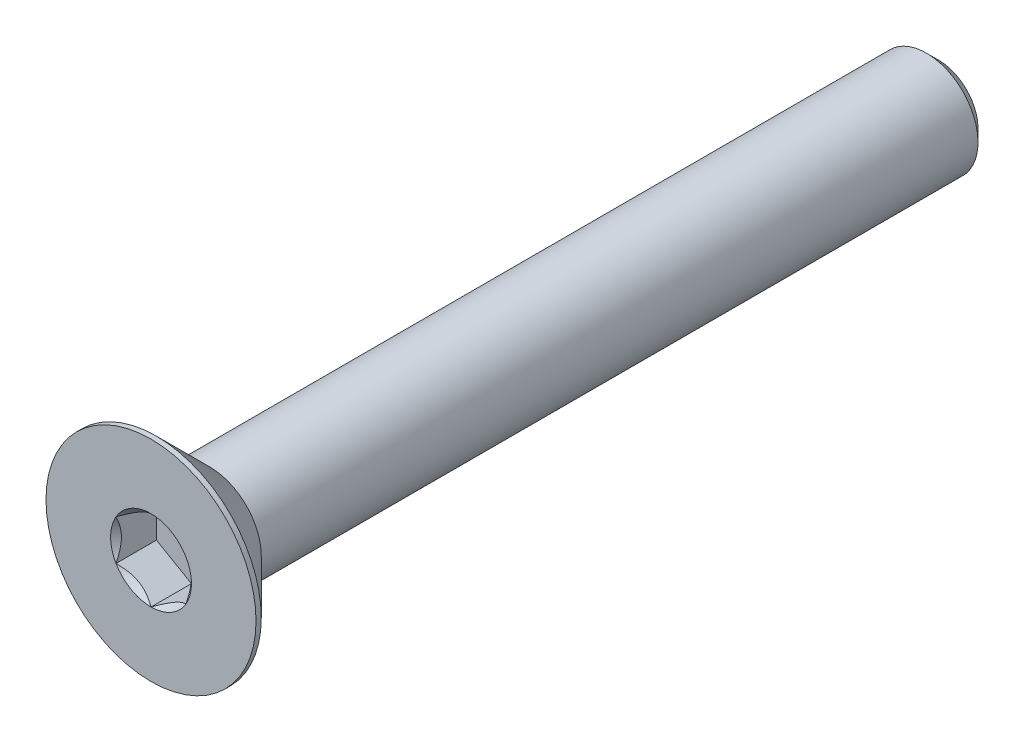
ISO-10303-21;
HEADER;
FILE_DESCRIPTION(('STEP AP214'),'2;1');
FILE_NAME('part.step','',(''),(''),'','','');
FILE_SCHEMA(('AUTOMOTIVE_DESIGN { 1 0 10303 214 1 1 1 1 }'));
ENDSEC;
DATA;
#1=APPLICATION_CONTEXT('core data for automotive mechanical design processes');
#2=APPLICATION_PROTOCOL_DEFINITION('international standard','automotive_design',2000,#1);
#3=PRODUCT_CONTEXT('',#1,'mechanical');
#4=PRODUCT('Part','Part','',(#3));
#5=PRODUCT_RELATED_PRODUCT_CATEGORY('part','',(#4));
#6=PRODUCT_DEFINITION_FORMATION('','',#4);
#7=PRODUCT_DEFINITION_CONTEXT('part definition',#1,'design');
#8=PRODUCT_DEFINITION('design','',#6,#7);
#9=PRODUCT_DEFINITION_SHAPE('','',#8);
#10=(LENGTH_UNIT() NAMED_UNIT(*) SI_UNIT(.MILLI.,.METRE.));
#11=(NAMED_UNIT(*) PLANE_ANGLE_UNIT() SI_UNIT($,.RADIAN.));
#12=(NAMED_UNIT(*) SI_UNIT($,.STERADIAN.) SOLID_ANGLE_UNIT());
#13=UNCERTAINTY_MEASURE_WITH_UNIT(LENGTH_MEASURE(1.E-05),#10,'distance_accuracy_value','');
#14=(GEOMETRIC_REPRESENTATION_CONTEXT(3) GLOBAL_UNCERTAINTY_ASSIGNED_CONTEXT((#13)) GLOBAL_UNIT_ASSIGNED_CONTEXT((#10,
#11,#12)) REPRESENTATION_CONTEXT('',''));
#15=CARTESIAN_POINT('',(0.,0.,0.));
#16=DIRECTION('',(0.,0.,1.));
#17=DIRECTION('',(1.,0.,0.));
#18=AXIS2_PLACEMENT_3D('',#15,#16,#17);
#19=CARTESIAN_POINT('',(0.,-2.3094010767585,-2.31));
#20=DIRECTION('',(0.5,-0.866025403784439,0.));
#21=DIRECTION('',(0.,0.,-1.));
#22=AXIS2_PLACEMENT_3D('',#19,#20,#21);
#23=PLANE('',#22);
#24=DIRECTION('',(0.,0.,1.));
#25=VECTOR('',#24,1.);
#26=CARTESIAN_POINT('',(0.,-2.3094010767585,-2.31));
#27=LINE('',#26,#25);
#28=CARTESIAN_POINT('',(0.,-2.3094010767585,-2.31));
#29=VERTEX_POINT('',#28);
#30=CARTESIAN_POINT('',(0.,-2.3094010767585,0.));
#31=VERTEX_POINT('',#30);
#32=EDGE_CURVE('E11',#29,#31,#27,.T.);
#33=ORIENTED_EDGE('',*,*,#32,.T.);
#34=CARTESIAN_POINT('',(-5.24513690485845E-12,-2.30940107676153,3.02721544112933E-12));
#35=CARTESIAN_POINT('',(1.,-1.73205080756888,-0.577350269191895));
#36=CARTESIAN_POINT('',(2.00000000000524,-1.15470053837622,3.02865722975403E-12));
#37=(BOUNDED_CURVE() B_SPLINE_CURVE(2,(#34,#35,#36),.UNSPECIFIED.,.F.,
.F.) B_SPLINE_CURVE_WITH_KNOTS((3,3),(-0.45323387245921,-0.135550185295981),
.UNSPECIFIED.) CURVE() GEOMETRIC_REPRESENTATION_ITEM() RATIONAL_B_SPLINE_CURVE((1.23205080756801,
1.42264973081124,1.23205080756801)) REPRESENTATION_ITEM(''));
#38=CARTESIAN_POINT('',(2.,-1.15470053837925,0.));
#39=VERTEX_POINT('',#38);
#40=EDGE_CURVE('E121',#31,#39,#37,.T.);
#41=ORIENTED_EDGE('',*,*,#40,.T.);
#42=DIRECTION('',(0.,0.,1.));
#43=VECTOR('',#42,1.);
#44=CARTESIAN_POINT('',(2.,-1.15470053837925,-2.31));
#45=LINE('',#44,#43);
#46=CARTESIAN_POINT('',(2.,-1.15470053837925,-2.31));
#47=VERTEX_POINT('',#46);
#48=EDGE_CURVE('E116',#47,#39,#45,.T.);
#49=ORIENTED_EDGE('',*,*,#48,.F.);
#50=DIRECTION('',(0.866025403784439,0.5,0.));
#51=VECTOR('',#50,1.);
#52=CARTESIAN_POINT('',(0.,-2.3094010767585,-2.31));
#53=LINE('',#52,#51);
#54=EDGE_CURVE('E119',#29,#47,#53,.T.);
#55=ORIENTED_EDGE('',*,*,#54,.F.);
#56=EDGE_LOOP('',(#33,#41,#49,#55));
#57=FACE_BOUND('',#56,.T.);
#58=ADVANCED_FACE('F17',(#57),#23,.F.);
#59=CARTESIAN_POINT('',(-2.,-1.15470053837925,-2.31));
#60=DIRECTION('',(-0.5,-0.866025403784439,0.));
#61=DIRECTION('',(-0.866025403784439,0.5,0.));
#62=AXIS2_PLACEMENT_3D('',#59,#60,#61);
#63=PLANE('',#62);
#64=DIRECTION('',(0.,0.,1.));
#65=VECTOR('',#64,1.);
#66=CARTESIAN_POINT('',(-2.,-1.15470053837925,-2.31));
#67=LINE('',#66,#65);
#68=CARTESIAN_POINT('',(-2.,-1.15470053837925,-2.31));
#69=VERTEX_POINT('',#68);
#70=CARTESIAN_POINT('',(-2.,-1.15470053837925,0.));
#71=VERTEX_POINT('',#70);
#72=EDGE_CURVE('E27',#69,#71,#67,.T.);
#73=ORIENTED_EDGE('',*,*,#72,.T.);
#74=CARTESIAN_POINT('',(-2.00000000000525,-1.15470053837622,3.02897262101568E-12));
#75=CARTESIAN_POINT('',(-1.,-1.73205080756888,-0.577350269191895));
#76=CARTESIAN_POINT('',(5.24518196075298E-12,-2.30940107676153,3.02811655901977E-12));
#77=(BOUNDED_CURVE() B_SPLINE_CURVE(2,(#74,#75,#76),.UNSPECIFIED.,.F.,
.F.) B_SPLINE_CURVE_WITH_KNOTS((3,3),(-0.45323387245921,-0.135550185295981),
.UNSPECIFIED.) CURVE() GEOMETRIC_REPRESENTATION_ITEM() RATIONAL_B_SPLINE_CURVE((1.23205080756801,
1.42264973081124,1.23205080756801)) REPRESENTATION_ITEM(''));
#78=EDGE_CURVE('E146',#71,#31,#77,.T.);
#79=ORIENTED_EDGE('',*,*,#78,.T.);
#80=ORIENTED_EDGE('',*,*,#32,.F.);
#81=DIRECTION('',(0.866025403784439,-0.5,0.));
#82=VECTOR('',#81,1.);
#83=CARTESIAN_POINT('',(-2.,-1.15470053837925,-2.31));
#84=LINE('',#83,#82);
#85=EDGE_CURVE('E127',#69,#29,#84,.T.);
#86=ORIENTED_EDGE('',*,*,#85,.F.);
#87=EDGE_LOOP('',(#73,#79,#80,#86));
#88=FACE_BOUND('',#87,.T.);
#89=ADVANCED_FACE('F314',(#88),#63,.F.);
#90=CARTESIAN_POINT('',(-2.,1.15470053837925,-2.31));
#91=DIRECTION('',(-1.,0.,0.));
#92=DIRECTION('',(0.,0.,1.));
#93=AXIS2_PLACEMENT_3D('',#90,#91,#92);
#94=PLANE('',#93);
#95=DIRECTION('',(0.,0.,1.));
#96=VECTOR('',#95,1.);
#97=CARTESIAN_POINT('',(-2.,1.15470053837925,-2.31));
#98=LINE('',#97,#96);
#99=CARTESIAN_POINT('',(-2.,1.15470053837925,-2.31));
#100=VERTEX_POINT('',#99);
#101=CARTESIAN_POINT('',(-2.,1.15470053837925,0.));
#102=VERTEX_POINT('',#101);
#103=EDGE_CURVE('E209',#100,#102,#98,.T.);
#104=ORIENTED_EDGE('',*,*,#103,.T.);
#105=CARTESIAN_POINT('',(-2.,1.15470053838531,3.02852206207046E-12));
#106=CARTESIAN_POINT('',(-2.,0.,-0.577350269191896));
#107=CARTESIAN_POINT('',(-2.,-1.15470053838531,3.0279813913362E-12));
#108=(BOUNDED_CURVE() B_SPLINE_CURVE(2,(#105,#106,#107),.UNSPECIFIED.,.F.,
.F.) B_SPLINE_CURVE_WITH_KNOTS((3,3),(-0.45323387245921,-0.135550185295981),
.UNSPECIFIED.) CURVE() GEOMETRIC_REPRESENTATION_ITEM() RATIONAL_B_SPLINE_CURVE((1.23205080756801,
1.42264973081124,1.23205080756801)) REPRESENTATION_ITEM(''));
#109=EDGE_CURVE('E152',#102,#71,#108,.T.);
#110=ORIENTED_EDGE('',*,*,#109,.T.);
#111=ORIENTED_EDGE('',*,*,#72,.F.);
#112=DIRECTION('',(0.,-1.,0.));
#113=VECTOR('',#112,1.);
#114=CARTESIAN_POINT('',(-2.,1.15470053837925,-2.31));
#115=LINE('',#114,#113);
#116=EDGE_CURVE('E172',#100,#69,#115,.T.);
#117=ORIENTED_EDGE('',*,*,#116,.F.);
#118=EDGE_LOOP('',(#104,#110,#111,#117));
#119=FACE_BOUND('',#118,.T.);
#120=ADVANCED_FACE('F318',(#119),#94,.F.);
#121=CARTESIAN_POINT('',(0.,2.3094010767585,-2.31));
#122=DIRECTION('',(-0.5,0.866025403784439,0.));
#123=DIRECTION('',(0.,0.,1.));
#124=AXIS2_PLACEMENT_3D('',#121,#122,#123);
#125=PLANE('',#124);
#126=DIRECTION('',(0.,0.,1.));
#127=VECTOR('',#126,1.);
#128=CARTESIAN_POINT('',(0.,2.3094010767585,-2.31));
#129=LINE('',#128,#127);
#130=CARTESIAN_POINT('',(0.,2.3094010767585,-2.31));
#131=VERTEX_POINT('',#130);
#132=CARTESIAN_POINT('',(0.,2.3094010767585,0.));
#133=VERTEX_POINT('',#132);
#134=EDGE_CURVE('E260',#131,#133,#129,.T.);
#135=ORIENTED_EDGE('',*,*,#134,.T.);
#136=CARTESIAN_POINT('',(5.24252366297619E-12,2.30940107676153,3.02680993807864E-12));
#137=CARTESIAN_POINT('',(-1.,1.73205080756888,-0.577350269191894));
#138=CARTESIAN_POINT('',(-2.00000000000525,1.15470053837622,3.02825172670333E-12));
#139=(BOUNDED_CURVE() B_SPLINE_CURVE(2,(#136,#137,#138),.UNSPECIFIED.,.F.,
.F.) B_SPLINE_CURVE_WITH_KNOTS((3,3),(-0.453233872459209,-0.135550185295981),
.UNSPECIFIED.) CURVE() GEOMETRIC_REPRESENTATION_ITEM() RATIONAL_B_SPLINE_CURVE((1.23205080756801,
1.42264973081124,1.23205080756801)) REPRESENTATION_ITEM(''));
#140=EDGE_CURVE('E156',#133,#102,#139,.T.);
#141=ORIENTED_EDGE('',*,*,#140,.T.);
#142=ORIENTED_EDGE('',*,*,#103,.F.);
#143=DIRECTION('',(-0.866025403784439,-0.5,0.));
#144=VECTOR('',#143,1.);
#145=CARTESIAN_POINT('',(0.,2.3094010767585,-2.31));
#146=LINE('',#145,#144);
#147=EDGE_CURVE('E192',#131,#100,#146,.T.);
#148=ORIENTED_EDGE('',*,*,#147,.F.);
#149=EDGE_LOOP('',(#135,#141,#142,#148));
#150=FACE_BOUND('',#149,.T.);
#151=ADVANCED_FACE('F322',(#150),#125,.F.);
#152=CARTESIAN_POINT('',(2.,1.15470053837925,-2.31));
#153=DIRECTION('',(0.5,0.866025403784439,0.));
#154=DIRECTION('',(0.,0.,-1.));
#155=AXIS2_PLACEMENT_3D('',#152,#153,#154);
#156=PLANE('',#155);
#157=DIRECTION('',(0.,0.,1.));
#158=VECTOR('',#157,1.);
#159=CARTESIAN_POINT('',(2.,1.15470053837925,-2.31));
#160=LINE('',#159,#158);
#161=CARTESIAN_POINT('',(2.,1.15470053837925,-2.31));
#162=VERTEX_POINT('',#161);
#163=CARTESIAN_POINT('',(2.,1.15470053837925,0.));
#164=VERTEX_POINT('',#163);
#165=EDGE_CURVE('E126',#162,#164,#160,.T.);
#166=ORIENTED_EDGE('',*,*,#165,.T.);
#167=CARTESIAN_POINT('',(2.00000000000524,1.15470053837622,3.0273506088129E-12));
#168=CARTESIAN_POINT('',(1.,1.73205080756888,-0.577350269191896));
#169=CARTESIAN_POINT('',(-5.24549735201463E-12,2.30940107676153,3.02766600007455E-12));
#170=(BOUNDED_CURVE() B_SPLINE_CURVE(2,(#167,#168,#169),.UNSPECIFIED.,.F.,
.F.) B_SPLINE_CURVE_WITH_KNOTS((3,3),(-0.45323387245921,-0.135550185295981),
.UNSPECIFIED.) CURVE() GEOMETRIC_REPRESENTATION_ITEM() RATIONAL_B_SPLINE_CURVE((1.23205080756801,
1.42264973081124,1.23205080756801)) REPRESENTATION_ITEM(''));
#171=EDGE_CURVE('E166',#164,#133,#170,.T.);
#172=ORIENTED_EDGE('',*,*,#171,.T.);
#173=ORIENTED_EDGE('',*,*,#134,.F.);
#174=DIRECTION('',(-0.866025403784439,0.5,0.));
#175=VECTOR('',#174,1.);
#176=CARTESIAN_POINT('',(2.,1.15470053837925,-2.31));
#177=LINE('',#176,#175);
#178=EDGE_CURVE('E136',#162,#131,#177,.T.);
#179=ORIENTED_EDGE('',*,*,#178,.F.);
#180=EDGE_LOOP('',(#166,#172,#173,#179));
#181=FACE_BOUND('',#180,.T.);
#182=ADVANCED_FACE('F332',(#181),#156,.F.);
#183=CARTESIAN_POINT('',(2.,-1.15470053837925,-2.31));
#184=DIRECTION('',(1.,0.,0.));
#185=DIRECTION('',(0.,1.,0.));
#186=AXIS2_PLACEMENT_3D('',#183,#184,#185);
#187=PLANE('',#186);
#188=ORIENTED_EDGE('',*,*,#48,.T.);
#189=CARTESIAN_POINT('',(2.,-1.1547005383853,3.02626926734265E-12));
#190=CARTESIAN_POINT('',(2.,0.,-0.577350269191895));
#191=CARTESIAN_POINT('',(2.,1.15470053838531,3.02852206206874E-12));
#192=(BOUNDED_CURVE() B_SPLINE_CURVE(2,(#189,#190,#191),.UNSPECIFIED.,.F.,
.F.) B_SPLINE_CURVE_WITH_KNOTS((3,3),(-0.453233872459802,-0.135550185296338),
.UNSPECIFIED.) CURVE() GEOMETRIC_REPRESENTATION_ITEM() RATIONAL_B_SPLINE_CURVE((1.23205080756872,
1.42264973081205,1.23205080756871)) REPRESENTATION_ITEM(''));
#193=EDGE_CURVE('E233',#39,#164,#192,.T.);
#194=ORIENTED_EDGE('',*,*,#193,.T.);
#195=ORIENTED_EDGE('',*,*,#165,.F.);
#196=DIRECTION('',(0.,1.,0.));
#197=VECTOR('',#196,1.);
#198=CARTESIAN_POINT('',(2.,-1.15470053837925,-2.31));
#199=LINE('',#198,#197);
#200=EDGE_CURVE('E130',#47,#162,#199,.T.);
#201=ORIENTED_EDGE('',*,*,#200,.F.);
#202=EDGE_LOOP('',(#188,#194,#195,#201));
#203=FACE_BOUND('',#202,.T.);
#204=ADVANCED_FACE('F131',(#203),#187,.F.);
#205=CARTESIAN_POINT('',(2.,-1.15470053837925,-2.31));
#206=DIRECTION('',(0.,0.,1.));
#207=DIRECTION('',(1.,0.,0.));
#208=AXIS2_PLACEMENT_3D('',#205,#206,#207);
#209=PLANE('',#208);
#210=ORIENTED_EDGE('',*,*,#54,.T.);
#211=ORIENTED_EDGE('',*,*,#200,.T.);
#212=ORIENTED_EDGE('',*,*,#178,.T.);
#213=ORIENTED_EDGE('',*,*,#147,.T.);
#214=ORIENTED_EDGE('',*,*,#116,.T.);
#215=ORIENTED_EDGE('',*,*,#85,.T.);
#216=EDGE_LOOP('',(#210,#211,#212,#213,#214,#215));
#217=FACE_BOUND('',#216,.T.);
#218=ADVANCED_FACE('F138',(#217),#209,.T.);
#219=CARTESIAN_POINT('',(0.,0.,0.));
#220=DIRECTION('',(0.,0.,1.));
#221=DIRECTION('',(1.,0.,0.));
#222=AXIS2_PLACEMENT_3D('',#219,#220,#221);
#223=CONICAL_SURFACE('',#222,2.3094010767585,0.78539816339745);
#224=CARTESIAN_POINT('',(0.,0.,0.));
#225=DIRECTION('',(0.,0.,1.));
#226=DIRECTION('',(1.,0.,0.));
#227=AXIS2_PLACEMENT_3D('',#224,#225,#226);
#228=CIRCLE('',#227,2.3094010767585);
#229=EDGE_CURVE('E206',#31,#39,#228,.T.);
#230=ORIENTED_EDGE('',*,*,#229,.T.);
#231=ORIENTED_EDGE('',*,*,#40,.F.);
#232=EDGE_LOOP('',(#230,#231));
#233=FACE_BOUND('',#232,.T.);
#234=ADVANCED_FACE('F325',(#233),#223,.F.);
#235=CARTESIAN_POINT('',(0.,0.,0.));
#236=DIRECTION('',(0.,0.,1.));
#237=DIRECTION('',(1.,0.,0.));
#238=AXIS2_PLACEMENT_3D('',#235,#236,#237);
#239=CONICAL_SURFACE('',#238,2.3094010767585,0.78539816339745);
#240=CARTESIAN_POINT('',(0.,0.,0.));
#241=DIRECTION('',(0.,0.,1.));
#242=DIRECTION('',(1.,0.,0.));
#243=AXIS2_PLACEMENT_3D('',#240,#241,#242);
#244=CIRCLE('',#243,2.3094010767585);
#245=EDGE_CURVE('E191',#71,#31,#244,.T.);
#246=ORIENTED_EDGE('',*,*,#245,.T.);
#247=ORIENTED_EDGE('',*,*,#78,.F.);
#248=EDGE_LOOP('',(#246,#247));
#249=FACE_BOUND('',#248,.T.);
#250=ADVANCED_FACE('F328',(#249),#239,.F.);
#251=CARTESIAN_POINT('',(0.,0.,0.));
#252=DIRECTION('',(0.,0.,1.));
#253=DIRECTION('',(-1.,0.,0.));
#254=AXIS2_PLACEMENT_3D('',#251,#252,#253);
#255=CONICAL_SURFACE('',#254,2.3094010767585,0.78539816339745);
#256=CARTESIAN_POINT('',(0.,0.,0.));
#257=DIRECTION('',(0.,0.,1.));
#258=DIRECTION('',(1.,0.,0.));
#259=AXIS2_PLACEMENT_3D('',#256,#257,#258);
#260=CIRCLE('',#259,2.3094010767585);
#261=EDGE_CURVE('E188',#102,#71,#260,.T.);
#262=ORIENTED_EDGE('',*,*,#261,.T.);
#263=ORIENTED_EDGE('',*,*,#109,.F.);
#264=EDGE_LOOP('',(#262,#263));
#265=FACE_BOUND('',#264,.T.);
#266=ADVANCED_FACE('F354',(#265),#255,.F.);
#267=CARTESIAN_POINT('',(0.,0.,0.));
#268=DIRECTION('',(0.,0.,1.));
#269=DIRECTION('',(1.,0.,0.));
#270=AXIS2_PLACEMENT_3D('',#267,#268,#269);
#271=CONICAL_SURFACE('',#270,2.3094010767585,0.78539816339745);
#272=CARTESIAN_POINT('',(0.,0.,0.));
#273=DIRECTION('',(0.,0.,1.));
#274=DIRECTION('',(1.,0.,0.));
#275=AXIS2_PLACEMENT_3D('',#272,#273,#274);
#276=CIRCLE('',#275,2.3094010767585);
#277=EDGE_CURVE('E182',#133,#102,#276,.T.);
#278=ORIENTED_EDGE('',*,*,#277,.T.);
#279=ORIENTED_EDGE('',*,*,#140,.F.);
#280=EDGE_LOOP('',(#278,#279));
#281=FACE_BOUND('',#280,.T.);
#282=ADVANCED_FACE('F341',(#281),#271,.F.);
#283=CARTESIAN_POINT('',(0.,0.,0.));
#284=DIRECTION('',(0.,0.,1.));
#285=DIRECTION('',(1.,0.,0.));
#286=AXIS2_PLACEMENT_3D('',#283,#284,#285);
#287=CONICAL_SURFACE('',#286,2.3094010767585,0.78539816339745);
#288=CARTESIAN_POINT('',(0.,0.,0.));
#289=DIRECTION('',(0.,0.,1.));
#290=DIRECTION('',(1.,0.,0.));
#291=AXIS2_PLACEMENT_3D('',#288,#289,#290);
#292=CIRCLE('',#291,2.3094010767585);
#293=EDGE_CURVE('E178',#164,#133,#292,.T.);
#294=ORIENTED_EDGE('',*,*,#293,.T.);
#295=ORIENTED_EDGE('',*,*,#171,.F.);
#296=EDGE_LOOP('',(#294,#295));
#297=FACE_BOUND('',#296,.T.);
#298=ADVANCED_FACE('F339',(#297),#287,.F.);
#299=CARTESIAN_POINT('',(0.,-3.,0.));
#300=DIRECTION('',(0.,0.,1.));
#301=DIRECTION('',(0.,-1.,0.));
#302=AXIS2_PLACEMENT_3D('',#299,#300,#301);
#303=PLANE('',#302);
#304=ORIENTED_EDGE('',*,*,#229,.F.);
#305=ORIENTED_EDGE('',*,*,#245,.F.);
#306=ORIENTED_EDGE('',*,*,#261,.F.);
#307=ORIENTED_EDGE('',*,*,#277,.F.);
#308=ORIENTED_EDGE('',*,*,#293,.F.);
#309=CARTESIAN_POINT('',(0.,0.,0.));
#310=DIRECTION('',(0.,0.,1.));
#311=DIRECTION('',(1.,0.,0.));
#312=AXIS2_PLACEMENT_3D('',#309,#310,#311);
#313=CIRCLE('',#312,2.3094010767585);
#314=EDGE_CURVE('E238',#39,#164,#313,.T.);
#315=ORIENTED_EDGE('',*,*,#314,.F.);
#316=EDGE_LOOP('',(#304,#305,#306,#307,#308,#315));
#317=FACE_BOUND('',#316,.T.);
#318=CARTESIAN_POINT('',(0.,0.,0.));
#319=DIRECTION('',(0.,0.,1.));
#320=DIRECTION('',(0.,-1.,0.));
#321=AXIS2_PLACEMENT_3D('',#318,#319,#320);
#322=CIRCLE('',#321,6.);
#323=CARTESIAN_POINT('',(0.,6.,0.));
#324=VERTEX_POINT('',#323);
#325=EDGE_CURVE('E246',#324,#324,#322,.T.);
#326=ORIENTED_EDGE('',*,*,#325,.T.);
#327=EDGE_LOOP('',(#326));
#328=FACE_BOUND('',#327,.T.);
#329=ADVANCED_FACE('F337',(#317,#328),#303,.T.);
#330=CARTESIAN_POINT('',(0.,-3.,-45.));
#331=DIRECTION('',(0.,0.,-1.));
#332=DIRECTION('',(0.,-1.,0.));
#333=AXIS2_PLACEMENT_3D('',#330,#331,#332);
#334=PLANE('',#333);
#335=CARTESIAN_POINT('',(0.,0.,-45.));
#336=DIRECTION('',(0.,0.,-1.));
#337=DIRECTION('',(1.,0.,0.));
#338=AXIS2_PLACEMENT_3D('',#335,#336,#337);
#339=CIRCLE('',#338,2.25);
#340=CARTESIAN_POINT('',(-2.25,0.,-45.));
#341=VERTEX_POINT('',#340);
#342=EDGE_CURVE('E173',#341,#341,#339,.T.);
#343=ORIENTED_EDGE('',*,*,#342,.T.);
#344=EDGE_LOOP('',(#343));
#345=FACE_BOUND('',#344,.T.);
#346=ADVANCED_FACE('F333',(#345),#334,.T.);
#347=CARTESIAN_POINT('',(0.,0.,0.));
#348=DIRECTION('',(0.,0.,1.));
#349=DIRECTION('',(0.,-1.,0.));
#350=AXIS2_PLACEMENT_3D('',#347,#348,#349);
#351=CYLINDRICAL_SURFACE('',#350,6.);
#352=ORIENTED_EDGE('',*,*,#325,.F.);
#353=DIRECTION('',(0.,0.,-1.));
#354=VECTOR('',#353,1.);
#355=CARTESIAN_POINT('',(0.,6.,0.));
#356=LINE('',#355,#354);
#357=CARTESIAN_POINT('',(0.,6.,-0.300000000000018));
#358=VERTEX_POINT('',#357);
#359=EDGE_CURVE('E20',#324,#358,#356,.T.);
#360=ORIENTED_EDGE('',*,*,#359,.T.);
#361=CARTESIAN_POINT('',(0.,0.,-0.300000000000012));
#362=DIRECTION('',(0.,0.,1.));
#363=DIRECTION('',(0.,-1.,0.));
#364=AXIS2_PLACEMENT_3D('',#361,#362,#363);
#365=CIRCLE('',#364,6.);
#366=EDGE_CURVE('E213',#358,#358,#365,.T.);
#367=ORIENTED_EDGE('',*,*,#366,.T.);
#368=ORIENTED_EDGE('',*,*,#359,.F.);
#369=EDGE_LOOP('',(#352,#360,#367,#368));
#370=FACE_BOUND('',#369,.T.);
#371=ADVANCED_FACE('F336',(#370),#351,.T.);
#372=CARTESIAN_POINT('',(0.,0.,0.));
#373=DIRECTION('',(0.,0.,1.));
#374=DIRECTION('',(1.,0.,0.));
#375=AXIS2_PLACEMENT_3D('',#372,#373,#374);
#376=CONICAL_SURFACE('',#375,2.3094010767585,0.78539816339745);
#377=ORIENTED_EDGE('',*,*,#193,.F.);
#378=ORIENTED_EDGE('',*,*,#314,.T.);
#379=EDGE_LOOP('',(#377,#378));
#380=FACE_BOUND('',#379,.T.);
#381=ADVANCED_FACE('F309',(#380),#376,.F.);
#382=CARTESIAN_POINT('',(0.,0.,-3.3));
#383=DIRECTION('',(0.,0.,1.));
#384=DIRECTION('',(0.,-1.,0.));
#385=AXIS2_PLACEMENT_3D('',#382,#383,#384);
#386=CONICAL_SURFACE('',#385,3.,0.785398163397449);
#387=ORIENTED_EDGE('',*,*,#366,.F.);
#388=DIRECTION('',(0.,-0.707106781186549,-0.707106781186546));
#389=VECTOR('',#388,1.);
#390=CARTESIAN_POINT('',(0.,3.,-3.3));
#391=LINE('',#390,#389);
#392=CARTESIAN_POINT('',(0.,2.942,-3.358));
#393=VERTEX_POINT('',#392);
#394=EDGE_CURVE('E239',#358,#393,#391,.T.);
#395=ORIENTED_EDGE('',*,*,#394,.T.);
#396=CARTESIAN_POINT('',(0.,0.,-3.358));
#397=DIRECTION('',(0.,0.,1.));
#398=DIRECTION('',(0.,1.,0.));
#399=AXIS2_PLACEMENT_3D('',#396,#397,#398);
#400=CIRCLE('',#399,2.942);
#401=CARTESIAN_POINT('',(0.,-2.942,-3.358));
#402=VERTEX_POINT('',#401);
#403=EDGE_CURVE('E214',#393,#402,#400,.T.);
#404=ORIENTED_EDGE('',*,*,#403,.T.);
#405=CARTESIAN_POINT('',(0.,0.,-3.358));
#406=DIRECTION('',(0.,0.,1.));
#407=DIRECTION('',(0.,1.,0.));
#408=AXIS2_PLACEMENT_3D('',#405,#406,#407);
#409=CIRCLE('',#408,2.942);
#410=EDGE_CURVE('E210',#402,#393,#409,.T.);
#411=ORIENTED_EDGE('',*,*,#410,.T.);
#412=ORIENTED_EDGE('',*,*,#394,.F.);
#413=EDGE_LOOP('',(#387,#395,#404,#411,#412));
#414=FACE_BOUND('',#413,.T.);
#415=ADVANCED_FACE('F297',(#414),#386,.T.);
#416=CARTESIAN_POINT('',(0.,0.,-45.));
#417=DIRECTION('',(0.,0.,-1.));
#418=DIRECTION('',(0.,1.,0.));
#419=AXIS2_PLACEMENT_3D('',#416,#417,#418);
#420=CYLINDRICAL_SURFACE('',#419,2.942);
#421=CARTESIAN_POINT('',(0.,0.,-44.308));
#422=DIRECTION('',(0.,0.,1.));
#423=DIRECTION('',(0.,1.,0.));
#424=AXIS2_PLACEMENT_3D('',#421,#422,#423);
#425=CIRCLE('',#424,2.942);
#426=CARTESIAN_POINT('',(0.,-2.942,-44.308));
#427=VERTEX_POINT('',#426);
#428=CARTESIAN_POINT('',(-2.942,0.,-44.308));
#429=VERTEX_POINT('',#428);
#430=EDGE_CURVE('E183',#427,#429,#425,.T.);
#431=ORIENTED_EDGE('',*,*,#430,.T.);
#432=CARTESIAN_POINT('',(0.,0.,-44.308));
#433=DIRECTION('',(0.,0.,1.));
#434=DIRECTION('',(0.,1.,0.));
#435=AXIS2_PLACEMENT_3D('',#432,#433,#434);
#436=CIRCLE('',#435,2.942);
#437=EDGE_CURVE('E187',#429,#427,#436,.T.);
#438=ORIENTED_EDGE('',*,*,#437,.T.);
#439=DIRECTION('',(0.,0.,1.));
#440=VECTOR('',#439,1.);
#441=CARTESIAN_POINT('',(0.,-2.942,-45.));
#442=LINE('',#441,#440);
#443=EDGE_CURVE('E215',#427,#402,#442,.T.);
#444=ORIENTED_EDGE('',*,*,#443,.T.);
#445=ORIENTED_EDGE('',*,*,#403,.F.);
#446=ORIENTED_EDGE('',*,*,#410,.F.);
#447=ORIENTED_EDGE('',*,*,#443,.F.);
#448=EDGE_LOOP('',(#431,#438,#444,#445,#446,#447));
#449=FACE_BOUND('',#448,.T.);
#450=ADVANCED_FACE('F298',(#449),#420,.T.);
#451=CARTESIAN_POINT('',(0.,0.,-44.625));
#452=DIRECTION('',(0.,0.,1.));
#453=DIRECTION('',(1.,0.,0.));
#454=AXIS2_PLACEMENT_3D('',#451,#452,#453);
#455=CONICAL_SURFACE('',#454,2.625,0.785398163397452);
#456=ORIENTED_EDGE('',*,*,#342,.F.);
#457=DIRECTION('',(-0.70710678118655,0.,0.707106781186545));
#458=VECTOR('',#457,1.);
#459=CARTESIAN_POINT('',(-2.625,0.,-44.625));
#460=LINE('',#459,#458);
#461=EDGE_CURVE('E177',#341,#429,#460,.T.);
#462=ORIENTED_EDGE('',*,*,#461,.T.);
#463=ORIENTED_EDGE('',*,*,#430,.F.);
#464=ORIENTED_EDGE('',*,*,#437,.F.);
#465=ORIENTED_EDGE('',*,*,#461,.F.);
#466=EDGE_LOOP('',(#456,#462,#463,#464,#465));
#467=FACE_BOUND('',#466,.T.);
#468=ADVANCED_FACE('F300',(#467),#455,.T.);
#469=CLOSED_SHELL('',(#58,#89,#120,#151,#182,#204,#218,#234,#250,#266,#282,#298,#329,#346,#371,
#381,#415,#450,#468));
#470=MANIFOLD_SOLID_BREP('B1',#469);
#471=ADVANCED_BREP_SHAPE_REPRESENTATION('',(#18,#470),#14);
#472=SHAPE_DEFINITION_REPRESENTATION(#9,#471);
ENDSEC;
END-ISO-10303-21;
